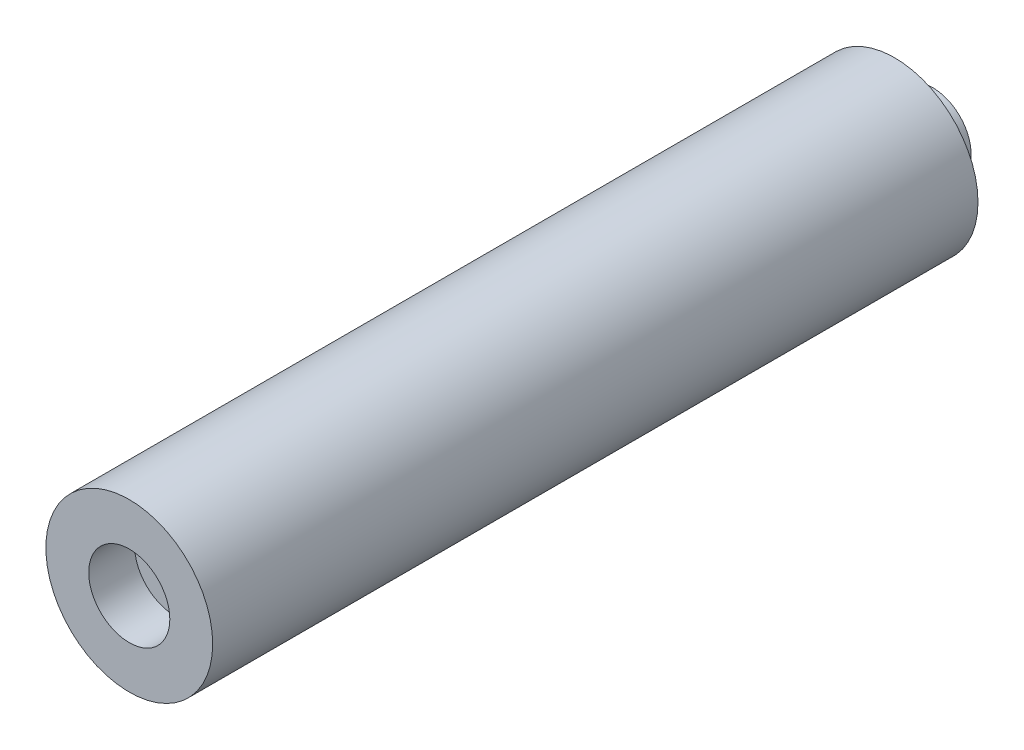
ISO-10303-21;
HEADER;
FILE_DESCRIPTION(('STEP AP214'),'2;1');
FILE_NAME('part.step','',(''),(''),'','','');
FILE_SCHEMA(('AUTOMOTIVE_DESIGN { 1 0 10303 214 1 1 1 1 }'));
ENDSEC;
DATA;
#1=APPLICATION_CONTEXT('core data for automotive mechanical design processes');
#2=APPLICATION_PROTOCOL_DEFINITION('international standard','automotive_design',2000,#1);
#3=PRODUCT_CONTEXT('',#1,'mechanical');
#4=PRODUCT('Part','Part','',(#3));
#5=PRODUCT_RELATED_PRODUCT_CATEGORY('part','',(#4));
#6=PRODUCT_DEFINITION_FORMATION('','',#4);
#7=PRODUCT_DEFINITION_CONTEXT('part definition',#1,'design');
#8=PRODUCT_DEFINITION('design','',#6,#7);
#9=PRODUCT_DEFINITION_SHAPE('','',#8);
#10=(LENGTH_UNIT() NAMED_UNIT(*) SI_UNIT(.MILLI.,.METRE.));
#11=(NAMED_UNIT(*) PLANE_ANGLE_UNIT() SI_UNIT($,.RADIAN.));
#12=(NAMED_UNIT(*) SI_UNIT($,.STERADIAN.) SOLID_ANGLE_UNIT());
#13=UNCERTAINTY_MEASURE_WITH_UNIT(LENGTH_MEASURE(1.E-05),#10,'distance_accuracy_value','');
#14=(GEOMETRIC_REPRESENTATION_CONTEXT(3) GLOBAL_UNCERTAINTY_ASSIGNED_CONTEXT((#13)) GLOBAL_UNIT_ASSIGNED_CONTEXT((#10,
#11,#12)) REPRESENTATION_CONTEXT('',''));
#15=CARTESIAN_POINT('',(0.,0.,0.));
#16=DIRECTION('',(0.,0.,1.));
#17=DIRECTION('',(1.,0.,0.));
#18=AXIS2_PLACEMENT_3D('',#15,#16,#17);
#19=CARTESIAN_POINT('',(0.,0.,50.));
#20=DIRECTION('',(0.,0.,-1.));
#21=DIRECTION('',(-1.,0.,0.));
#22=AXIS2_PLACEMENT_3D('',#19,#20,#21);
#23=CYLINDRICAL_SURFACE('',#22,5.45);
#24=CARTESIAN_POINT('',(0.,0.,50.));
#25=DIRECTION('',(0.,0.,1.));
#26=DIRECTION('',(1.,0.,0.));
#27=AXIS2_PLACEMENT_3D('',#24,#25,#26);
#28=CIRCLE('',#27,5.45);
#29=CARTESIAN_POINT('',(5.45,0.,50.));
#30=VERTEX_POINT('',#29);
#31=EDGE_CURVE('E44',#30,#30,#28,.T.);
#32=ORIENTED_EDGE('',*,*,#31,.F.);
#33=EDGE_LOOP('',(#32));
#34=FACE_BOUND('',#33,.T.);
#35=CARTESIAN_POINT('',(0.,0.,0.));
#36=DIRECTION('',(0.,0.,1.));
#37=DIRECTION('',(1.,0.,0.));
#38=AXIS2_PLACEMENT_3D('',#35,#36,#37);
#39=CIRCLE('',#38,5.45);
#40=CARTESIAN_POINT('',(5.45,0.,0.));
#41=VERTEX_POINT('',#40);
#42=EDGE_CURVE('E39',#41,#41,#39,.T.);
#43=ORIENTED_EDGE('',*,*,#42,.T.);
#44=EDGE_LOOP('',(#43));
#45=FACE_BOUND('',#44,.T.);
#46=ADVANCED_FACE('F36',(#34,#45),#23,.T.);
#47=CARTESIAN_POINT('',(0.,0.,50.));
#48=DIRECTION('',(0.,0.,1.));
#49=DIRECTION('',(1.,0.,0.));
#50=AXIS2_PLACEMENT_3D('',#47,#48,#49);
#51=PLANE('',#50);
#52=CARTESIAN_POINT('',(0.,0.,50.));
#53=DIRECTION('',(0.,0.,1.));
#54=DIRECTION('',(1.,0.,0.));
#55=AXIS2_PLACEMENT_3D('',#52,#53,#54);
#56=CIRCLE('',#55,2.65);
#57=CARTESIAN_POINT('',(2.65,0.,50.));
#58=VERTEX_POINT('',#57);
#59=EDGE_CURVE('E56',#58,#58,#56,.T.);
#60=ORIENTED_EDGE('',*,*,#59,.F.);
#61=EDGE_LOOP('',(#60));
#62=FACE_BOUND('',#61,.T.);
#63=ORIENTED_EDGE('',*,*,#31,.T.);
#64=EDGE_LOOP('',(#63));
#65=FACE_BOUND('',#64,.T.);
#66=ADVANCED_FACE('F73',(#62,#65),#51,.T.);
#67=CARTESIAN_POINT('',(0.,0.,0.));
#68=DIRECTION('',(0.,0.,1.));
#69=DIRECTION('',(1.,0.,0.));
#70=AXIS2_PLACEMENT_3D('',#67,#68,#69);
#71=PLANE('',#70);
#72=CARTESIAN_POINT('',(0.,0.,0.));
#73=DIRECTION('',(0.,0.,-1.));
#74=DIRECTION('',(-1.,0.,0.));
#75=AXIS2_PLACEMENT_3D('',#72,#73,#74);
#76=CIRCLE('',#75,2.5);
#77=CARTESIAN_POINT('',(-2.5,0.,0.));
#78=VERTEX_POINT('',#77);
#79=EDGE_CURVE('E10',#78,#78,#76,.T.);
#80=ORIENTED_EDGE('',*,*,#79,.F.);
#81=EDGE_LOOP('',(#80));
#82=FACE_BOUND('',#81,.T.);
#83=ORIENTED_EDGE('',*,*,#42,.F.);
#84=EDGE_LOOP('',(#83));
#85=FACE_BOUND('',#84,.T.);
#86=ADVANCED_FACE('F76',(#82,#85),#71,.F.);
#87=CARTESIAN_POINT('',(0.,0.,-2.5));
#88=DIRECTION('',(0.,0.,1.));
#89=DIRECTION('',(1.,0.,0.));
#90=AXIS2_PLACEMENT_3D('',#87,#88,#89);
#91=CYLINDRICAL_SURFACE('',#90,2.5);
#92=CARTESIAN_POINT('',(0.,0.,-2.5));
#93=DIRECTION('',(0.,0.,-1.));
#94=DIRECTION('',(-1.,0.,0.));
#95=AXIS2_PLACEMENT_3D('',#92,#93,#94);
#96=CIRCLE('',#95,2.5);
#97=CARTESIAN_POINT('',(-2.5,0.,-2.5));
#98=VERTEX_POINT('',#97);
#99=EDGE_CURVE('E51',#98,#98,#96,.T.);
#100=ORIENTED_EDGE('',*,*,#99,.F.);
#101=EDGE_LOOP('',(#100));
#102=FACE_BOUND('',#101,.T.);
#103=ORIENTED_EDGE('',*,*,#79,.T.);
#104=EDGE_LOOP('',(#103));
#105=FACE_BOUND('',#104,.T.);
#106=ADVANCED_FACE('F87',(#102,#105),#91,.T.);
#107=CARTESIAN_POINT('',(0.,0.,-2.5));
#108=DIRECTION('',(0.,0.,-1.));
#109=DIRECTION('',(-1.,0.,0.));
#110=AXIS2_PLACEMENT_3D('',#107,#108,#109);
#111=PLANE('',#110);
#112=ORIENTED_EDGE('',*,*,#99,.T.);
#113=EDGE_LOOP('',(#112));
#114=FACE_BOUND('',#113,.T.);
#115=ADVANCED_FACE('F69',(#114),#111,.T.);
#116=CARTESIAN_POINT('',(0.,0.,47.));
#117=DIRECTION('',(0.,0.,1.));
#118=DIRECTION('',(1.,0.,0.));
#119=AXIS2_PLACEMENT_3D('',#116,#117,#118);
#120=CYLINDRICAL_SURFACE('',#119,2.65);
#121=CARTESIAN_POINT('',(0.,0.,47.));
#122=DIRECTION('',(0.,0.,1.));
#123=DIRECTION('',(1.,0.,0.));
#124=AXIS2_PLACEMENT_3D('',#121,#122,#123);
#125=CIRCLE('',#124,2.65);
#126=CARTESIAN_POINT('',(2.65,0.,47.));
#127=VERTEX_POINT('',#126);
#128=EDGE_CURVE('E55',#127,#127,#125,.T.);
#129=ORIENTED_EDGE('',*,*,#128,.F.);
#130=EDGE_LOOP('',(#129));
#131=FACE_BOUND('',#130,.T.);
#132=ORIENTED_EDGE('',*,*,#59,.T.);
#133=EDGE_LOOP('',(#132));
#134=FACE_BOUND('',#133,.T.);
#135=ADVANCED_FACE('F66',(#131,#134),#120,.F.);
#136=CARTESIAN_POINT('',(0.,0.,47.));
#137=DIRECTION('',(0.,0.,1.));
#138=DIRECTION('',(1.,0.,0.));
#139=AXIS2_PLACEMENT_3D('',#136,#137,#138);
#140=PLANE('',#139);
#141=ORIENTED_EDGE('',*,*,#128,.T.);
#142=EDGE_LOOP('',(#141));
#143=FACE_BOUND('',#142,.T.);
#144=ADVANCED_FACE('F64',(#143),#140,.T.);
#145=CLOSED_SHELL('',(#46,#66,#86,#106,#115,#135,#144));
#146=MANIFOLD_SOLID_BREP('B2',#145);
#147=ADVANCED_BREP_SHAPE_REPRESENTATION('',(#18,#146),#14);
#148=SHAPE_DEFINITION_REPRESENTATION(#9,#147);
ENDSEC;
END-ISO-10303-21;
